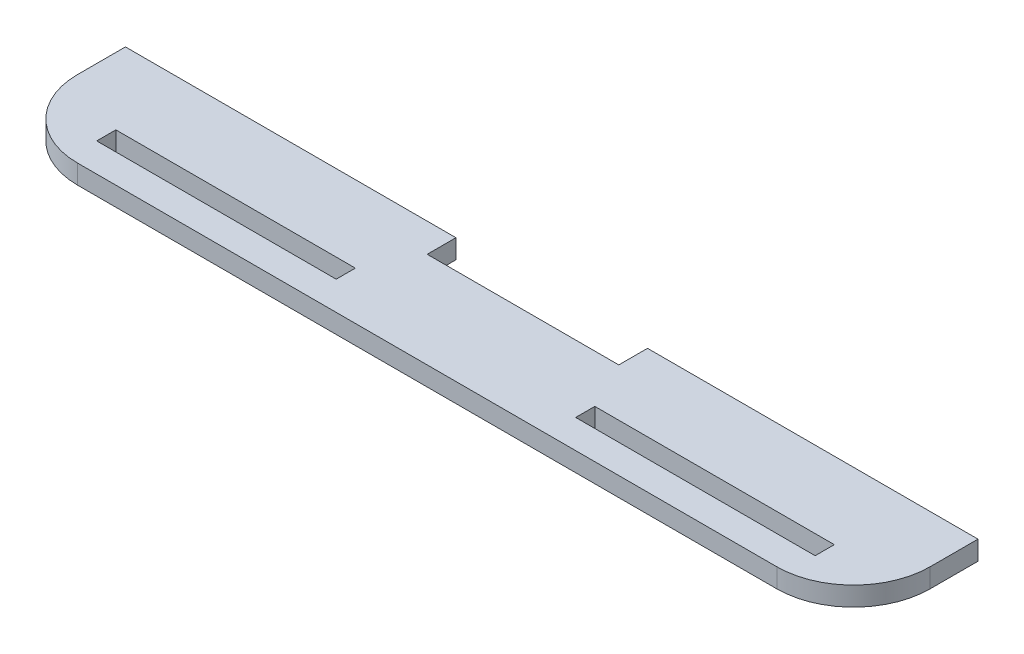
ISO-10303-21;
HEADER;
FILE_DESCRIPTION(('STEP AP214'),'2;1');
FILE_NAME('part.step','',(''),(''),'','','');
FILE_SCHEMA(('AUTOMOTIVE_DESIGN { 1 0 10303 214 1 1 1 1 }'));
ENDSEC;
DATA;
#1=APPLICATION_CONTEXT('core data for automotive mechanical design processes');
#2=APPLICATION_PROTOCOL_DEFINITION('international standard','automotive_design',2000,#1);
#3=PRODUCT_CONTEXT('',#1,'mechanical');
#4=PRODUCT('Part','Part','',(#3));
#5=PRODUCT_RELATED_PRODUCT_CATEGORY('part','',(#4));
#6=PRODUCT_DEFINITION_FORMATION('','',#4);
#7=PRODUCT_DEFINITION_CONTEXT('part definition',#1,'design');
#8=PRODUCT_DEFINITION('design','',#6,#7);
#9=PRODUCT_DEFINITION_SHAPE('','',#8);
#10=(LENGTH_UNIT() NAMED_UNIT(*) SI_UNIT(.MILLI.,.METRE.));
#11=(NAMED_UNIT(*) PLANE_ANGLE_UNIT() SI_UNIT($,.RADIAN.));
#12=(NAMED_UNIT(*) SI_UNIT($,.STERADIAN.) SOLID_ANGLE_UNIT());
#13=UNCERTAINTY_MEASURE_WITH_UNIT(LENGTH_MEASURE(1.E-05),#10,'distance_accuracy_value','');
#14=(GEOMETRIC_REPRESENTATION_CONTEXT(3) GLOBAL_UNCERTAINTY_ASSIGNED_CONTEXT((#13)) GLOBAL_UNIT_ASSIGNED_CONTEXT((#10,
#11,#12)) REPRESENTATION_CONTEXT('',''));
#15=CARTESIAN_POINT('',(0.,0.,0.));
#16=DIRECTION('',(0.,0.,1.));
#17=DIRECTION('',(1.,0.,0.));
#18=AXIS2_PLACEMENT_3D('',#15,#16,#17);
#19=CARTESIAN_POINT('',(0.,0.,-3.));
#20=DIRECTION('',(0.,0.,-1.));
#21=DIRECTION('',(0.,1.,0.));
#22=AXIS2_PLACEMENT_3D('',#19,#20,#21);
#23=PLANE('',#22);
#24=DIRECTION('',(0.,-1.,0.));
#25=VECTOR('',#24,1.);
#26=CARTESIAN_POINT('',(10.,0.,-3.));
#27=LINE('',#26,#25);
#28=CARTESIAN_POINT('',(10.,23.5,-3.));
#29=VERTEX_POINT('',#28);
#30=CARTESIAN_POINT('',(10.,21.5,-3.));
#31=VERTEX_POINT('',#30);
#32=EDGE_CURVE('E164',#29,#31,#27,.T.);
#33=ORIENTED_EDGE('',*,*,#32,.F.);
#34=DIRECTION('',(-1.,0.,0.));
#35=VECTOR('',#34,1.);
#36=CARTESIAN_POINT('',(44.5,23.5,-3.));
#37=LINE('',#36,#35);
#38=CARTESIAN_POINT('',(44.5,23.5,-3.));
#39=VERTEX_POINT('',#38);
#40=EDGE_CURVE('E178',#39,#29,#37,.T.);
#41=ORIENTED_EDGE('',*,*,#40,.F.);
#42=DIRECTION('',(0.,1.,0.));
#43=VECTOR('',#42,1.);
#44=CARTESIAN_POINT('',(44.5,23.5,-3.));
#45=LINE('',#44,#43);
#46=CARTESIAN_POINT('',(44.5,21.5,-3.));
#47=VERTEX_POINT('',#46);
#48=EDGE_CURVE('E200',#47,#39,#45,.T.);
#49=ORIENTED_EDGE('',*,*,#48,.F.);
#50=DIRECTION('',(1.,0.,0.));
#51=VECTOR('',#50,1.);
#52=CARTESIAN_POINT('',(44.5,21.5,-3.));
#53=LINE('',#52,#51);
#54=EDGE_CURVE('E181',#31,#47,#53,.T.);
#55=ORIENTED_EDGE('',*,*,#54,.F.);
#56=EDGE_LOOP('',(#33,#41,#49,#55));
#57=FACE_BOUND('',#56,.T.);
#58=ADVANCED_FACE('F35',(#57),#23,.T.);
#59=CARTESIAN_POINT('',(44.5,21.5,99.0224690738243));
#60=DIRECTION('',(0.,1.,0.));
#61=DIRECTION('',(-1.,0.,0.));
#62=AXIS2_PLACEMENT_3D('',#59,#60,#61);
#63=PLANE('',#62);
#64=DIRECTION('',(1.,0.,0.));
#65=VECTOR('',#64,1.);
#66=CARTESIAN_POINT('',(12.5,21.5,5.));
#67=LINE('',#66,#65);
#68=CARTESIAN_POINT('',(12.5,21.5,5.));
#69=VERTEX_POINT('',#68);
#70=CARTESIAN_POINT('',(37.5,21.5,5.));
#71=VERTEX_POINT('',#70);
#72=EDGE_CURVE('E279',#69,#71,#67,.T.);
#73=ORIENTED_EDGE('',*,*,#72,.F.);
#74=DIRECTION('',(0.,0.,-1.));
#75=VECTOR('',#74,1.);
#76=CARTESIAN_POINT('',(12.5,21.5,5.));
#77=LINE('',#76,#75);
#78=CARTESIAN_POINT('',(12.5,21.5,7.));
#79=VERTEX_POINT('',#78);
#80=EDGE_CURVE('E273',#79,#69,#77,.T.);
#81=ORIENTED_EDGE('',*,*,#80,.F.);
#82=DIRECTION('',(-1.,0.,0.));
#83=VECTOR('',#82,1.);
#84=CARTESIAN_POINT('',(12.5,21.5,7.));
#85=LINE('',#84,#83);
#86=CARTESIAN_POINT('',(37.5,21.5,7.));
#87=VERTEX_POINT('',#86);
#88=EDGE_CURVE('E285',#87,#79,#85,.T.);
#89=ORIENTED_EDGE('',*,*,#88,.F.);
#90=DIRECTION('',(0.,0.,1.));
#91=VECTOR('',#90,1.);
#92=CARTESIAN_POINT('',(37.5,21.5,5.));
#93=LINE('',#92,#91);
#94=EDGE_CURVE('E282',#71,#87,#93,.T.);
#95=ORIENTED_EDGE('',*,*,#94,.F.);
#96=EDGE_LOOP('',(#73,#81,#89,#95));
#97=FACE_BOUND('',#96,.T.);
#98=DIRECTION('',(1.,0.,0.));
#99=VECTOR('',#98,1.);
#100=CARTESIAN_POINT('',(-37.5,21.5,5.));
#101=LINE('',#100,#99);
#102=CARTESIAN_POINT('',(-37.5,21.5,5.));
#103=VERTEX_POINT('',#102);
#104=CARTESIAN_POINT('',(-12.5,21.5,5.));
#105=VERTEX_POINT('',#104);
#106=EDGE_CURVE('E299',#103,#105,#101,.T.);
#107=ORIENTED_EDGE('',*,*,#106,.F.);
#108=DIRECTION('',(0.,0.,-1.));
#109=VECTOR('',#108,1.);
#110=CARTESIAN_POINT('',(-37.5,21.5,5.));
#111=LINE('',#110,#109);
#112=CARTESIAN_POINT('',(-37.5,21.5,7.));
#113=VERTEX_POINT('',#112);
#114=EDGE_CURVE('E291',#113,#103,#111,.T.);
#115=ORIENTED_EDGE('',*,*,#114,.F.);
#116=DIRECTION('',(-1.,0.,0.));
#117=VECTOR('',#116,1.);
#118=CARTESIAN_POINT('',(-37.5,21.5,7.));
#119=LINE('',#118,#117);
#120=CARTESIAN_POINT('',(-12.5,21.5,7.));
#121=VERTEX_POINT('',#120);
#122=EDGE_CURVE('E305',#121,#113,#119,.T.);
#123=ORIENTED_EDGE('',*,*,#122,.F.);
#124=DIRECTION('',(0.,0.,1.));
#125=VECTOR('',#124,1.);
#126=CARTESIAN_POINT('',(-12.5,21.5,5.));
#127=LINE('',#126,#125);
#128=EDGE_CURVE('E302',#105,#121,#127,.T.);
#129=ORIENTED_EDGE('',*,*,#128,.F.);
#130=EDGE_LOOP('',(#107,#115,#123,#129));
#131=FACE_BOUND('',#130,.T.);
#132=DIRECTION('',(-1.,0.,0.));
#133=VECTOR('',#132,1.);
#134=CARTESIAN_POINT('',(44.5,21.5,9.99999999999999));
#135=LINE('',#134,#133);
#136=CARTESIAN_POINT('',(36.5,21.5,9.99999999999999));
#137=VERTEX_POINT('',#136);
#138=CARTESIAN_POINT('',(-36.5,21.5,9.99999999999999));
#139=VERTEX_POINT('',#138);
#140=EDGE_CURVE('E210',#137,#139,#135,.T.);
#141=ORIENTED_EDGE('',*,*,#140,.T.);
#142=CARTESIAN_POINT('',(-36.5,21.5,2.));
#143=DIRECTION('',(0.,1.,0.));
#144=DIRECTION('',(-1.,0.,0.));
#145=AXIS2_PLACEMENT_3D('',#142,#143,#144);
#146=CIRCLE('',#145,8.);
#147=CARTESIAN_POINT('',(-44.5,21.5,2.));
#148=VERTEX_POINT('',#147);
#149=EDGE_CURVE('E43',#139,#148,#146,.F.);
#150=ORIENTED_EDGE('',*,*,#149,.T.);
#151=DIRECTION('',(0.,0.,-1.));
#152=VECTOR('',#151,1.);
#153=CARTESIAN_POINT('',(-44.5,21.5,99.0224690738243));
#154=LINE('',#153,#152);
#155=CARTESIAN_POINT('',(-44.5,21.5,-3.));
#156=VERTEX_POINT('',#155);
#157=EDGE_CURVE('E212',#148,#156,#154,.T.);
#158=ORIENTED_EDGE('',*,*,#157,.T.);
#159=CARTESIAN_POINT('',(-10.,21.5,-3.));
#160=VERTEX_POINT('',#159);
#161=EDGE_CURVE('E203',#156,#160,#53,.T.);
#162=ORIENTED_EDGE('',*,*,#161,.T.);
#163=DIRECTION('',(0.,0.,1.));
#164=VECTOR('',#163,1.);
#165=CARTESIAN_POINT('',(-9.99999999999988,21.5,99.0224690738243));
#166=LINE('',#165,#164);
#167=CARTESIAN_POINT('',(-10.,21.5,0.));
#168=VERTEX_POINT('',#167);
#169=EDGE_CURVE('E271',#160,#168,#166,.T.);
#170=ORIENTED_EDGE('',*,*,#169,.T.);
#171=DIRECTION('',(1.,0.,0.));
#172=VECTOR('',#171,1.);
#173=CARTESIAN_POINT('',(44.5,21.5,0.));
#174=LINE('',#173,#172);
#175=CARTESIAN_POINT('',(10.,21.5,0.));
#176=VERTEX_POINT('',#175);
#177=EDGE_CURVE('E270',#168,#176,#174,.T.);
#178=ORIENTED_EDGE('',*,*,#177,.T.);
#179=DIRECTION('',(0.,0.,-1.));
#180=VECTOR('',#179,1.);
#181=CARTESIAN_POINT('',(10.0000000000001,21.5,99.0224690738243));
#182=LINE('',#181,#180);
#183=EDGE_CURVE('E268',#176,#31,#182,.T.);
#184=ORIENTED_EDGE('',*,*,#183,.T.);
#185=ORIENTED_EDGE('',*,*,#54,.T.);
#186=DIRECTION('',(0.,0.,-1.));
#187=VECTOR('',#186,1.);
#188=CARTESIAN_POINT('',(44.5,21.5,99.0224690738243));
#189=LINE('',#188,#187);
#190=CARTESIAN_POINT('',(44.5,21.5,2.));
#191=VERTEX_POINT('',#190);
#192=EDGE_CURVE('E202',#191,#47,#189,.T.);
#193=ORIENTED_EDGE('',*,*,#192,.F.);
#194=CARTESIAN_POINT('',(36.5,21.5,2.));
#195=DIRECTION('',(0.,1.,0.));
#196=DIRECTION('',(-1.,0.,0.));
#197=AXIS2_PLACEMENT_3D('',#194,#195,#196);
#198=CIRCLE('',#197,8.);
#199=EDGE_CURVE('E50',#191,#137,#198,.F.);
#200=ORIENTED_EDGE('',*,*,#199,.T.);
#201=EDGE_LOOP('',(#141,#150,#158,#162,#170,#178,#184,#185,#193,#200));
#202=FACE_BOUND('',#201,.T.);
#203=ADVANCED_FACE('F254',(#97,#131,#202),#63,.F.);
#204=CARTESIAN_POINT('',(-44.5,23.5,99.0224690738243));
#205=DIRECTION('',(1.,0.,0.));
#206=DIRECTION('',(0.,0.,-1.));
#207=AXIS2_PLACEMENT_3D('',#204,#205,#206);
#208=PLANE('',#207);
#209=ORIENTED_EDGE('',*,*,#157,.F.);
#210=DIRECTION('',(0.,1.,0.));
#211=VECTOR('',#210,1.);
#212=CARTESIAN_POINT('',(-44.5,23.5,2.));
#213=LINE('',#212,#211);
#214=CARTESIAN_POINT('',(-44.5,23.5,2.));
#215=VERTEX_POINT('',#214);
#216=EDGE_CURVE('E182',#148,#215,#213,.T.);
#217=ORIENTED_EDGE('',*,*,#216,.T.);
#218=DIRECTION('',(0.,0.,-1.));
#219=VECTOR('',#218,1.);
#220=CARTESIAN_POINT('',(-44.5,23.5,99.0224690738243));
#221=LINE('',#220,#219);
#222=CARTESIAN_POINT('',(-44.5,23.5,-3.));
#223=VERTEX_POINT('',#222);
#224=EDGE_CURVE('E214',#215,#223,#221,.T.);
#225=ORIENTED_EDGE('',*,*,#224,.T.);
#226=DIRECTION('',(0.,-1.,0.));
#227=VECTOR('',#226,1.);
#228=CARTESIAN_POINT('',(-44.5,23.5,-3.));
#229=LINE('',#228,#227);
#230=EDGE_CURVE('E189',#223,#156,#229,.T.);
#231=ORIENTED_EDGE('',*,*,#230,.T.);
#232=EDGE_LOOP('',(#209,#217,#225,#231));
#233=FACE_BOUND('',#232,.T.);
#234=ADVANCED_FACE('F259',(#233),#208,.F.);
#235=CARTESIAN_POINT('',(44.5,23.5,99.0224690738243));
#236=DIRECTION('',(0.,-1.,0.));
#237=DIRECTION('',(1.,0.,0.));
#238=AXIS2_PLACEMENT_3D('',#235,#236,#237);
#239=PLANE('',#238);
#240=DIRECTION('',(-1.,0.,0.));
#241=VECTOR('',#240,1.);
#242=CARTESIAN_POINT('',(44.5,23.5,7.00000000000001));
#243=LINE('',#242,#241);
#244=CARTESIAN_POINT('',(37.5,23.5,7.));
#245=VERTEX_POINT('',#244);
#246=CARTESIAN_POINT('',(12.5,23.5,7.));
#247=VERTEX_POINT('',#246);
#248=EDGE_CURVE('E235',#245,#247,#243,.T.);
#249=ORIENTED_EDGE('',*,*,#248,.T.);
#250=DIRECTION('',(0.,0.,-1.));
#251=VECTOR('',#250,1.);
#252=CARTESIAN_POINT('',(12.5,23.5,99.0224690738243));
#253=LINE('',#252,#251);
#254=CARTESIAN_POINT('',(12.5,23.5,5.));
#255=VERTEX_POINT('',#254);
#256=EDGE_CURVE('E238',#247,#255,#253,.T.);
#257=ORIENTED_EDGE('',*,*,#256,.T.);
#258=DIRECTION('',(1.,0.,0.));
#259=VECTOR('',#258,1.);
#260=CARTESIAN_POINT('',(44.5,23.5,5.));
#261=LINE('',#260,#259);
#262=CARTESIAN_POINT('',(37.5,23.5,5.));
#263=VERTEX_POINT('',#262);
#264=EDGE_CURVE('E229',#255,#263,#261,.T.);
#265=ORIENTED_EDGE('',*,*,#264,.T.);
#266=DIRECTION('',(0.,0.,1.));
#267=VECTOR('',#266,1.);
#268=CARTESIAN_POINT('',(37.5,23.5,99.0224690738243));
#269=LINE('',#268,#267);
#270=EDGE_CURVE('E232',#263,#245,#269,.T.);
#271=ORIENTED_EDGE('',*,*,#270,.T.);
#272=EDGE_LOOP('',(#249,#257,#265,#271));
#273=FACE_BOUND('',#272,.T.);
#274=DIRECTION('',(-1.,0.,0.));
#275=VECTOR('',#274,1.);
#276=CARTESIAN_POINT('',(44.5,23.5,7.00000000000001));
#277=LINE('',#276,#275);
#278=CARTESIAN_POINT('',(-12.5,23.5,7.));
#279=VERTEX_POINT('',#278);
#280=CARTESIAN_POINT('',(-37.5,23.5,7.));
#281=VERTEX_POINT('',#280);
#282=EDGE_CURVE('E223',#279,#281,#277,.T.);
#283=ORIENTED_EDGE('',*,*,#282,.T.);
#284=DIRECTION('',(0.,0.,-1.));
#285=VECTOR('',#284,1.);
#286=CARTESIAN_POINT('',(-37.4999999999997,23.5,99.0224690738245));
#287=LINE('',#286,#285);
#288=CARTESIAN_POINT('',(-37.5,23.5,5.));
#289=VERTEX_POINT('',#288);
#290=EDGE_CURVE('E226',#281,#289,#287,.T.);
#291=ORIENTED_EDGE('',*,*,#290,.T.);
#292=DIRECTION('',(1.,0.,0.));
#293=VECTOR('',#292,1.);
#294=CARTESIAN_POINT('',(44.5,23.5,5.));
#295=LINE('',#294,#293);
#296=CARTESIAN_POINT('',(-12.5,23.5,5.));
#297=VERTEX_POINT('',#296);
#298=EDGE_CURVE('E209',#289,#297,#295,.T.);
#299=ORIENTED_EDGE('',*,*,#298,.T.);
#300=DIRECTION('',(0.,0.,1.));
#301=VECTOR('',#300,1.);
#302=CARTESIAN_POINT('',(-12.5000000000001,23.5,99.0224690738242));
#303=LINE('',#302,#301);
#304=EDGE_CURVE('E220',#297,#279,#303,.T.);
#305=ORIENTED_EDGE('',*,*,#304,.T.);
#306=EDGE_LOOP('',(#283,#291,#299,#305));
#307=FACE_BOUND('',#306,.T.);
#308=ORIENTED_EDGE('',*,*,#224,.F.);
#309=CARTESIAN_POINT('',(-36.5,23.5,2.));
#310=DIRECTION('',(0.,-1.,0.));
#311=DIRECTION('',(1.,0.,0.));
#312=AXIS2_PLACEMENT_3D('',#309,#310,#311);
#313=CIRCLE('',#312,8.);
#314=CARTESIAN_POINT('',(-36.5,23.5,9.99999999999999));
#315=VERTEX_POINT('',#314);
#316=EDGE_CURVE('E246',#215,#315,#313,.F.);
#317=ORIENTED_EDGE('',*,*,#316,.T.);
#318=DIRECTION('',(1.,0.,0.));
#319=VECTOR('',#318,1.);
#320=CARTESIAN_POINT('',(44.5,23.5,9.99999999999999));
#321=LINE('',#320,#319);
#322=CARTESIAN_POINT('',(36.5,23.5,9.99999999999999));
#323=VERTEX_POINT('',#322);
#324=EDGE_CURVE('E206',#315,#323,#321,.T.);
#325=ORIENTED_EDGE('',*,*,#324,.T.);
#326=CARTESIAN_POINT('',(36.5,23.5,2.));
#327=DIRECTION('',(0.,-1.,0.));
#328=DIRECTION('',(1.,0.,0.));
#329=AXIS2_PLACEMENT_3D('',#326,#327,#328);
#330=CIRCLE('',#329,8.);
#331=CARTESIAN_POINT('',(44.5,23.5,2.));
#332=VERTEX_POINT('',#331);
#333=EDGE_CURVE('E244',#323,#332,#330,.F.);
#334=ORIENTED_EDGE('',*,*,#333,.T.);
#335=DIRECTION('',(0.,0.,-1.));
#336=VECTOR('',#335,1.);
#337=CARTESIAN_POINT('',(44.5,23.5,99.0224690738243));
#338=LINE('',#337,#336);
#339=EDGE_CURVE('E188',#332,#39,#338,.T.);
#340=ORIENTED_EDGE('',*,*,#339,.T.);
#341=ORIENTED_EDGE('',*,*,#40,.T.);
#342=DIRECTION('',(0.,0.,-1.));
#343=VECTOR('',#342,1.);
#344=CARTESIAN_POINT('',(10.,23.5,-3.));
#345=LINE('',#344,#343);
#346=CARTESIAN_POINT('',(10.,23.5,0.));
#347=VERTEX_POINT('',#346);
#348=EDGE_CURVE('E161',#347,#29,#345,.T.);
#349=ORIENTED_EDGE('',*,*,#348,.F.);
#350=DIRECTION('',(1.,0.,0.));
#351=VECTOR('',#350,1.);
#352=CARTESIAN_POINT('',(10.,23.5,0.));
#353=LINE('',#352,#351);
#354=CARTESIAN_POINT('',(-10.,23.5,0.));
#355=VERTEX_POINT('',#354);
#356=EDGE_CURVE('E362',#355,#347,#353,.T.);
#357=ORIENTED_EDGE('',*,*,#356,.F.);
#358=DIRECTION('',(0.,0.,1.));
#359=VECTOR('',#358,1.);
#360=CARTESIAN_POINT('',(-10.,23.5,-3.));
#361=LINE('',#360,#359);
#362=CARTESIAN_POINT('',(-10.,23.5,-3.));
#363=VERTEX_POINT('',#362);
#364=EDGE_CURVE('E172',#363,#355,#361,.T.);
#365=ORIENTED_EDGE('',*,*,#364,.F.);
#366=EDGE_CURVE('E190',#363,#223,#37,.T.);
#367=ORIENTED_EDGE('',*,*,#366,.T.);
#368=EDGE_LOOP('',(#308,#317,#325,#334,#340,#341,#349,#357,#365,#367));
#369=FACE_BOUND('',#368,.T.);
#370=ADVANCED_FACE('F186',(#273,#307,#369),#239,.F.);
#371=CARTESIAN_POINT('',(44.5,23.5,99.0224690738243));
#372=DIRECTION('',(-1.,0.,0.));
#373=DIRECTION('',(0.,0.,1.));
#374=AXIS2_PLACEMENT_3D('',#371,#372,#373);
#375=PLANE('',#374);
#376=ORIENTED_EDGE('',*,*,#339,.F.);
#377=DIRECTION('',(0.,-1.,0.));
#378=VECTOR('',#377,1.);
#379=CARTESIAN_POINT('',(44.5,23.5,2.));
#380=LINE('',#379,#378);
#381=EDGE_CURVE('E11',#332,#191,#380,.T.);
#382=ORIENTED_EDGE('',*,*,#381,.T.);
#383=ORIENTED_EDGE('',*,*,#192,.T.);
#384=ORIENTED_EDGE('',*,*,#48,.T.);
#385=EDGE_LOOP('',(#376,#382,#383,#384));
#386=FACE_BOUND('',#385,.T.);
#387=ADVANCED_FACE('F265',(#386),#375,.F.);
#388=CARTESIAN_POINT('',(0.,0.,10.));
#389=DIRECTION('',(0.,0.,-1.));
#390=DIRECTION('',(-1.,0.,0.));
#391=AXIS2_PLACEMENT_3D('',#388,#389,#390);
#392=PLANE('',#391);
#393=ORIENTED_EDGE('',*,*,#324,.F.);
#394=DIRECTION('',(0.,1.,0.));
#395=VECTOR('',#394,1.);
#396=CARTESIAN_POINT('',(-36.5,0.,10.));
#397=LINE('',#396,#395);
#398=EDGE_CURVE('E57',#315,#139,#397,.F.);
#399=ORIENTED_EDGE('',*,*,#398,.T.);
#400=ORIENTED_EDGE('',*,*,#140,.F.);
#401=DIRECTION('',(0.,-1.,0.));
#402=VECTOR('',#401,1.);
#403=CARTESIAN_POINT('',(36.5,0.,10.));
#404=LINE('',#403,#402);
#405=EDGE_CURVE('E248',#137,#323,#404,.F.);
#406=ORIENTED_EDGE('',*,*,#405,.T.);
#407=EDGE_LOOP('',(#393,#399,#400,#406));
#408=FACE_BOUND('',#407,.T.);
#409=ADVANCED_FACE('F263',(#408),#392,.F.);
#410=DIRECTION('',(0.,1.,0.));
#411=VECTOR('',#410,1.);
#412=CARTESIAN_POINT('',(-10.,0.,-3.));
#413=LINE('',#412,#411);
#414=EDGE_CURVE('E183',#160,#363,#413,.T.);
#415=ORIENTED_EDGE('',*,*,#414,.F.);
#416=ORIENTED_EDGE('',*,*,#161,.F.);
#417=ORIENTED_EDGE('',*,*,#230,.F.);
#418=ORIENTED_EDGE('',*,*,#366,.F.);
#419=EDGE_LOOP('',(#415,#416,#417,#418));
#420=FACE_BOUND('',#419,.T.);
#421=ADVANCED_FACE('F337',(#420),#23,.T.);
#422=CARTESIAN_POINT('',(-37.5,31.5,5.));
#423=DIRECTION('',(-1.,0.,0.));
#424=DIRECTION('',(0.,0.,1.));
#425=AXIS2_PLACEMENT_3D('',#422,#423,#424);
#426=PLANE('',#425);
#427=DIRECTION('',(0.,-1.,0.));
#428=VECTOR('',#427,1.);
#429=CARTESIAN_POINT('',(-37.5,31.5,7.));
#430=LINE('',#429,#428);
#431=EDGE_CURVE('E195',#281,#113,#430,.T.);
#432=ORIENTED_EDGE('',*,*,#431,.T.);
#433=ORIENTED_EDGE('',*,*,#114,.T.);
#434=DIRECTION('',(0.,-1.,0.));
#435=VECTOR('',#434,1.);
#436=CARTESIAN_POINT('',(-37.5,31.5,5.));
#437=LINE('',#436,#435);
#438=EDGE_CURVE('E198',#289,#103,#437,.T.);
#439=ORIENTED_EDGE('',*,*,#438,.F.);
#440=ORIENTED_EDGE('',*,*,#290,.F.);
#441=EDGE_LOOP('',(#432,#433,#439,#440));
#442=FACE_BOUND('',#441,.T.);
#443=ADVANCED_FACE('F328',(#442),#426,.F.);
#444=CARTESIAN_POINT('',(-37.5,31.5,7.));
#445=DIRECTION('',(0.,0.,1.));
#446=DIRECTION('',(1.,0.,0.));
#447=AXIS2_PLACEMENT_3D('',#444,#445,#446);
#448=PLANE('',#447);
#449=DIRECTION('',(0.,-1.,0.));
#450=VECTOR('',#449,1.);
#451=CARTESIAN_POINT('',(-12.5,31.5,7.));
#452=LINE('',#451,#450);
#453=EDGE_CURVE('E309',#279,#121,#452,.T.);
#454=ORIENTED_EDGE('',*,*,#453,.T.);
#455=ORIENTED_EDGE('',*,*,#122,.T.);
#456=ORIENTED_EDGE('',*,*,#431,.F.);
#457=ORIENTED_EDGE('',*,*,#282,.F.);
#458=EDGE_LOOP('',(#454,#455,#456,#457));
#459=FACE_BOUND('',#458,.T.);
#460=ADVANCED_FACE('F329',(#459),#448,.F.);
#461=CARTESIAN_POINT('',(-12.5,31.5,5.));
#462=DIRECTION('',(1.,0.,0.));
#463=DIRECTION('',(0.,0.,-1.));
#464=AXIS2_PLACEMENT_3D('',#461,#462,#463);
#465=PLANE('',#464);
#466=DIRECTION('',(0.,-1.,0.));
#467=VECTOR('',#466,1.);
#468=CARTESIAN_POINT('',(-12.5,31.5,5.));
#469=LINE('',#468,#467);
#470=EDGE_CURVE('E310',#297,#105,#469,.T.);
#471=ORIENTED_EDGE('',*,*,#470,.T.);
#472=ORIENTED_EDGE('',*,*,#128,.T.);
#473=ORIENTED_EDGE('',*,*,#453,.F.);
#474=ORIENTED_EDGE('',*,*,#304,.F.);
#475=EDGE_LOOP('',(#471,#472,#473,#474));
#476=FACE_BOUND('',#475,.T.);
#477=ADVANCED_FACE('F324',(#476),#465,.F.);
#478=CARTESIAN_POINT('',(-37.5,31.5,5.));
#479=DIRECTION('',(0.,0.,-1.));
#480=DIRECTION('',(-1.,0.,0.));
#481=AXIS2_PLACEMENT_3D('',#478,#479,#480);
#482=PLANE('',#481);
#483=ORIENTED_EDGE('',*,*,#438,.T.);
#484=ORIENTED_EDGE('',*,*,#106,.T.);
#485=ORIENTED_EDGE('',*,*,#470,.F.);
#486=ORIENTED_EDGE('',*,*,#298,.F.);
#487=EDGE_LOOP('',(#483,#484,#485,#486));
#488=FACE_BOUND('',#487,.T.);
#489=ADVANCED_FACE('F317',(#488),#482,.F.);
#490=CARTESIAN_POINT('',(12.5,31.5,5.));
#491=DIRECTION('',(-1.,0.,0.));
#492=DIRECTION('',(0.,0.,1.));
#493=AXIS2_PLACEMENT_3D('',#490,#491,#492);
#494=PLANE('',#493);
#495=DIRECTION('',(0.,-1.,0.));
#496=VECTOR('',#495,1.);
#497=CARTESIAN_POINT('',(12.5,31.5,7.));
#498=LINE('',#497,#496);
#499=EDGE_CURVE('E289',#247,#79,#498,.T.);
#500=ORIENTED_EDGE('',*,*,#499,.T.);
#501=ORIENTED_EDGE('',*,*,#80,.T.);
#502=DIRECTION('',(0.,-1.,0.));
#503=VECTOR('',#502,1.);
#504=CARTESIAN_POINT('',(12.5,31.5,5.));
#505=LINE('',#504,#503);
#506=EDGE_CURVE('E288',#255,#69,#505,.T.);
#507=ORIENTED_EDGE('',*,*,#506,.F.);
#508=ORIENTED_EDGE('',*,*,#256,.F.);
#509=EDGE_LOOP('',(#500,#501,#507,#508));
#510=FACE_BOUND('',#509,.T.);
#511=ADVANCED_FACE('F384',(#510),#494,.F.);
#512=CARTESIAN_POINT('',(12.5,31.5,7.));
#513=DIRECTION('',(0.,0.,1.));
#514=DIRECTION('',(1.,0.,0.));
#515=AXIS2_PLACEMENT_3D('',#512,#513,#514);
#516=PLANE('',#515);
#517=DIRECTION('',(0.,-1.,0.));
#518=VECTOR('',#517,1.);
#519=CARTESIAN_POINT('',(37.5,31.5,7.));
#520=LINE('',#519,#518);
#521=EDGE_CURVE('E292',#245,#87,#520,.T.);
#522=ORIENTED_EDGE('',*,*,#521,.T.);
#523=ORIENTED_EDGE('',*,*,#88,.T.);
#524=ORIENTED_EDGE('',*,*,#499,.F.);
#525=ORIENTED_EDGE('',*,*,#248,.F.);
#526=EDGE_LOOP('',(#522,#523,#524,#525));
#527=FACE_BOUND('',#526,.T.);
#528=ADVANCED_FACE('F381',(#527),#516,.F.);
#529=CARTESIAN_POINT('',(37.5,31.5,5.));
#530=DIRECTION('',(1.,0.,0.));
#531=DIRECTION('',(0.,0.,-1.));
#532=AXIS2_PLACEMENT_3D('',#529,#530,#531);
#533=PLANE('',#532);
#534=DIRECTION('',(0.,-1.,0.));
#535=VECTOR('',#534,1.);
#536=CARTESIAN_POINT('',(37.5,31.5,5.));
#537=LINE('',#536,#535);
#538=EDGE_CURVE('E294',#263,#71,#537,.T.);
#539=ORIENTED_EDGE('',*,*,#538,.T.);
#540=ORIENTED_EDGE('',*,*,#94,.T.);
#541=ORIENTED_EDGE('',*,*,#521,.F.);
#542=ORIENTED_EDGE('',*,*,#270,.F.);
#543=EDGE_LOOP('',(#539,#540,#541,#542));
#544=FACE_BOUND('',#543,.T.);
#545=ADVANCED_FACE('F375',(#544),#533,.F.);
#546=CARTESIAN_POINT('',(12.5,31.5,5.));
#547=DIRECTION('',(0.,0.,-1.));
#548=DIRECTION('',(-1.,0.,0.));
#549=AXIS2_PLACEMENT_3D('',#546,#547,#548);
#550=PLANE('',#549);
#551=ORIENTED_EDGE('',*,*,#506,.T.);
#552=ORIENTED_EDGE('',*,*,#72,.T.);
#553=ORIENTED_EDGE('',*,*,#538,.F.);
#554=ORIENTED_EDGE('',*,*,#264,.F.);
#555=EDGE_LOOP('',(#551,#552,#553,#554));
#556=FACE_BOUND('',#555,.T.);
#557=ADVANCED_FACE('F368',(#556),#550,.F.);
#558=CARTESIAN_POINT('',(10.,13.5,0.));
#559=DIRECTION('',(0.,0.,1.));
#560=DIRECTION('',(1.,0.,0.));
#561=AXIS2_PLACEMENT_3D('',#558,#559,#560);
#562=PLANE('',#561);
#563=DIRECTION('',(0.,1.,0.));
#564=VECTOR('',#563,1.);
#565=CARTESIAN_POINT('',(-10.,13.5,0.));
#566=LINE('',#565,#564);
#567=EDGE_CURVE('E360',#168,#355,#566,.T.);
#568=ORIENTED_EDGE('',*,*,#567,.T.);
#569=ORIENTED_EDGE('',*,*,#356,.T.);
#570=DIRECTION('',(0.,1.,0.));
#571=VECTOR('',#570,1.);
#572=CARTESIAN_POINT('',(10.,13.5,0.));
#573=LINE('',#572,#571);
#574=EDGE_CURVE('E167',#176,#347,#573,.T.);
#575=ORIENTED_EDGE('',*,*,#574,.F.);
#576=ORIENTED_EDGE('',*,*,#177,.F.);
#577=EDGE_LOOP('',(#568,#569,#575,#576));
#578=FACE_BOUND('',#577,.T.);
#579=ADVANCED_FACE('F366',(#578),#562,.F.);
#580=CARTESIAN_POINT('',(10.,13.5,-3.));
#581=DIRECTION('',(1.,0.,0.));
#582=DIRECTION('',(0.,0.,-1.));
#583=AXIS2_PLACEMENT_3D('',#580,#581,#582);
#584=PLANE('',#583);
#585=ORIENTED_EDGE('',*,*,#574,.T.);
#586=ORIENTED_EDGE('',*,*,#348,.T.);
#587=ORIENTED_EDGE('',*,*,#32,.T.);
#588=ORIENTED_EDGE('',*,*,#183,.F.);
#589=EDGE_LOOP('',(#585,#586,#587,#588));
#590=FACE_BOUND('',#589,.T.);
#591=ADVANCED_FACE('F163',(#590),#584,.F.);
#592=CARTESIAN_POINT('',(-10.,13.5,-3.));
#593=DIRECTION('',(-1.,0.,0.));
#594=DIRECTION('',(0.,0.,1.));
#595=AXIS2_PLACEMENT_3D('',#592,#593,#594);
#596=PLANE('',#595);
#597=ORIENTED_EDGE('',*,*,#414,.T.);
#598=ORIENTED_EDGE('',*,*,#364,.T.);
#599=ORIENTED_EDGE('',*,*,#567,.F.);
#600=ORIENTED_EDGE('',*,*,#169,.F.);
#601=EDGE_LOOP('',(#597,#598,#599,#600));
#602=FACE_BOUND('',#601,.T.);
#603=ADVANCED_FACE('F359',(#602),#596,.F.);
#604=CARTESIAN_POINT('',(-36.5,23.5,2.));
#605=DIRECTION('',(0.,1.,0.));
#606=DIRECTION('',(0.,0.,1.));
#607=AXIS2_PLACEMENT_3D('',#604,#605,#606);
#608=CYLINDRICAL_SURFACE('',#607,8.);
#609=ORIENTED_EDGE('',*,*,#149,.F.);
#610=ORIENTED_EDGE('',*,*,#398,.F.);
#611=ORIENTED_EDGE('',*,*,#316,.F.);
#612=ORIENTED_EDGE('',*,*,#216,.F.);
#613=EDGE_LOOP('',(#609,#610,#611,#612));
#614=FACE_BOUND('',#613,.T.);
#615=ADVANCED_FACE('F261',(#614),#608,.T.);
#616=CARTESIAN_POINT('',(36.5,23.5,2.));
#617=DIRECTION('',(0.,-1.,0.));
#618=DIRECTION('',(0.,0.,-1.));
#619=AXIS2_PLACEMENT_3D('',#616,#617,#618);
#620=CYLINDRICAL_SURFACE('',#619,8.);
#621=ORIENTED_EDGE('',*,*,#333,.F.);
#622=ORIENTED_EDGE('',*,*,#405,.F.);
#623=ORIENTED_EDGE('',*,*,#199,.F.);
#624=ORIENTED_EDGE('',*,*,#381,.F.);
#625=EDGE_LOOP('',(#621,#622,#623,#624));
#626=FACE_BOUND('',#625,.T.);
#627=ADVANCED_FACE('F37',(#626),#620,.T.);
#628=CLOSED_SHELL('',(#58,#203,#234,#370,#387,#409,#421,#443,#460,#477,#489,#511,#528,#545,#557,
#579,#591,#603,#615,#627));
#629=MANIFOLD_SOLID_BREP('B2',#628);
#630=ADVANCED_BREP_SHAPE_REPRESENTATION('',(#18,#629),#14);
#631=SHAPE_DEFINITION_REPRESENTATION(#9,#630);
ENDSEC;
END-ISO-10303-21;
